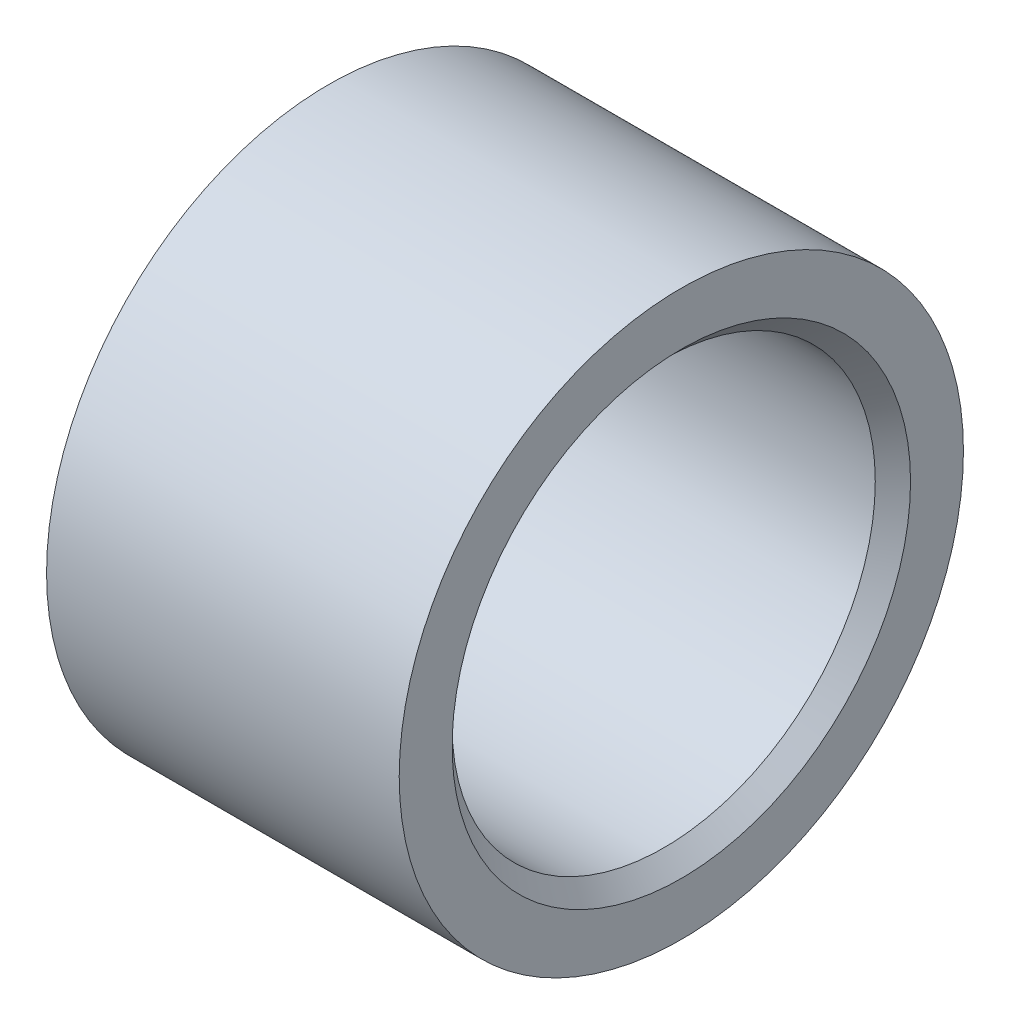
ISO-10303-21;
HEADER;
FILE_DESCRIPTION(('STEP AP214'),'2;1');
FILE_NAME('part.step','',(''),(''),'','','');
FILE_SCHEMA(('AUTOMOTIVE_DESIGN { 1 0 10303 214 1 1 1 1 }'));
ENDSEC;
DATA;
#1=APPLICATION_CONTEXT('core data for automotive mechanical design processes');
#2=APPLICATION_PROTOCOL_DEFINITION('international standard','automotive_design',2000,#1);
#3=PRODUCT_CONTEXT('',#1,'mechanical');
#4=PRODUCT('Part','Part','',(#3));
#5=PRODUCT_RELATED_PRODUCT_CATEGORY('part','',(#4));
#6=PRODUCT_DEFINITION_FORMATION('','',#4);
#7=PRODUCT_DEFINITION_CONTEXT('part definition',#1,'design');
#8=PRODUCT_DEFINITION('design','',#6,#7);
#9=PRODUCT_DEFINITION_SHAPE('','',#8);
#10=(LENGTH_UNIT() NAMED_UNIT(*) SI_UNIT(.MILLI.,.METRE.));
#11=(NAMED_UNIT(*) PLANE_ANGLE_UNIT() SI_UNIT($,.RADIAN.));
#12=(NAMED_UNIT(*) SI_UNIT($,.STERADIAN.) SOLID_ANGLE_UNIT());
#13=UNCERTAINTY_MEASURE_WITH_UNIT(LENGTH_MEASURE(1.E-05),#10,'distance_accuracy_value','');
#14=(GEOMETRIC_REPRESENTATION_CONTEXT(3) GLOBAL_UNCERTAINTY_ASSIGNED_CONTEXT((#13)) GLOBAL_UNIT_ASSIGNED_CONTEXT((#10,
#11,#12)) REPRESENTATION_CONTEXT('',''));
#15=CARTESIAN_POINT('',(0.,0.,0.));
#16=DIRECTION('',(0.,0.,1.));
#17=DIRECTION('',(1.,0.,0.));
#18=AXIS2_PLACEMENT_3D('',#15,#16,#17);
#19=CARTESIAN_POINT('',(10.,0.,0.));
#20=DIRECTION('',(1.,0.,0.));
#21=DIRECTION('',(0.,0.,-1.));
#22=AXIS2_PLACEMENT_3D('',#19,#20,#21);
#23=PLANE('',#22);
#24=CARTESIAN_POINT('',(10.,0.,0.));
#25=DIRECTION('',(1.,0.,0.));
#26=DIRECTION('',(0.,0.,-1.));
#27=AXIS2_PLACEMENT_3D('',#24,#25,#26);
#28=CIRCLE('',#27,6.50000000000001);
#29=CARTESIAN_POINT('',(10.,0.,-6.50000000000001));
#30=VERTEX_POINT('',#29);
#31=EDGE_CURVE('E10',#30,#30,#28,.F.);
#32=ORIENTED_EDGE('',*,*,#31,.T.);
#33=EDGE_LOOP('',(#32));
#34=FACE_BOUND('',#33,.T.);
#35=CARTESIAN_POINT('',(10.,0.,0.));
#36=DIRECTION('',(1.,0.,0.));
#37=DIRECTION('',(0.,0.,-1.));
#38=AXIS2_PLACEMENT_3D('',#35,#36,#37);
#39=CIRCLE('',#38,8.);
#40=CARTESIAN_POINT('',(10.,0.,-8.));
#41=VERTEX_POINT('',#40);
#42=EDGE_CURVE('E51',#41,#41,#39,.T.);
#43=ORIENTED_EDGE('',*,*,#42,.T.);
#44=EDGE_LOOP('',(#43));
#45=FACE_BOUND('',#44,.T.);
#46=ADVANCED_FACE('F31',(#34,#45),#23,.T.);
#47=CARTESIAN_POINT('',(0.,0.,0.));
#48=DIRECTION('',(1.,0.,0.));
#49=DIRECTION('',(0.,0.,-1.));
#50=AXIS2_PLACEMENT_3D('',#47,#48,#49);
#51=PLANE('',#50);
#52=CARTESIAN_POINT('',(0.,0.,0.));
#53=DIRECTION('',(1.,0.,0.));
#54=DIRECTION('',(0.,0.,-1.));
#55=AXIS2_PLACEMENT_3D('',#52,#53,#54);
#56=CIRCLE('',#55,6.5);
#57=CARTESIAN_POINT('',(0.,0.,-6.5));
#58=VERTEX_POINT('',#57);
#59=EDGE_CURVE('E46',#58,#58,#56,.T.);
#60=ORIENTED_EDGE('',*,*,#59,.T.);
#61=EDGE_LOOP('',(#60));
#62=FACE_BOUND('',#61,.T.);
#63=CARTESIAN_POINT('',(0.,0.,0.));
#64=DIRECTION('',(1.,0.,0.));
#65=DIRECTION('',(0.,0.,-1.));
#66=AXIS2_PLACEMENT_3D('',#63,#64,#65);
#67=CIRCLE('',#66,8.);
#68=CARTESIAN_POINT('',(0.,0.,-8.));
#69=VERTEX_POINT('',#68);
#70=EDGE_CURVE('E52',#69,#69,#67,.T.);
#71=ORIENTED_EDGE('',*,*,#70,.F.);
#72=EDGE_LOOP('',(#71));
#73=FACE_BOUND('',#72,.T.);
#74=ADVANCED_FACE('F63',(#62,#73),#51,.F.);
#75=CARTESIAN_POINT('',(10.,0.,0.));
#76=DIRECTION('',(-1.,0.,0.));
#77=DIRECTION('',(0.,0.,1.));
#78=AXIS2_PLACEMENT_3D('',#75,#76,#77);
#79=CYLINDRICAL_SURFACE('',#78,8.);
#80=ORIENTED_EDGE('',*,*,#42,.F.);
#81=EDGE_LOOP('',(#80));
#82=FACE_BOUND('',#81,.T.);
#83=ORIENTED_EDGE('',*,*,#70,.T.);
#84=EDGE_LOOP('',(#83));
#85=FACE_BOUND('',#84,.T.);
#86=ADVANCED_FACE('F59',(#82,#85),#79,.T.);
#87=CARTESIAN_POINT('',(10.,0.,0.));
#88=DIRECTION('',(-1.,0.,0.));
#89=DIRECTION('',(0.,0.,1.));
#90=AXIS2_PLACEMENT_3D('',#87,#88,#89);
#91=CYLINDRICAL_SURFACE('',#90,6.);
#92=CARTESIAN_POINT('',(0.500000000000006,0.,0.));
#93=DIRECTION('',(1.,0.,0.));
#94=DIRECTION('',(0.,0.,-1.));
#95=AXIS2_PLACEMENT_3D('',#92,#93,#94);
#96=CIRCLE('',#95,6.);
#97=CARTESIAN_POINT('',(0.500000000000006,0.,-6.));
#98=VERTEX_POINT('',#97);
#99=EDGE_CURVE('E38',#98,#98,#96,.F.);
#100=ORIENTED_EDGE('',*,*,#99,.T.);
#101=EDGE_LOOP('',(#100));
#102=FACE_BOUND('',#101,.T.);
#103=CARTESIAN_POINT('',(9.49999999999999,0.,0.));
#104=DIRECTION('',(1.,0.,0.));
#105=DIRECTION('',(0.,0.,-1.));
#106=AXIS2_PLACEMENT_3D('',#103,#104,#105);
#107=CIRCLE('',#106,6.);
#108=CARTESIAN_POINT('',(9.49999999999999,0.,-6.));
#109=VERTEX_POINT('',#108);
#110=EDGE_CURVE('E42',#109,#109,#107,.T.);
#111=ORIENTED_EDGE('',*,*,#110,.T.);
#112=EDGE_LOOP('',(#111));
#113=FACE_BOUND('',#112,.T.);
#114=ADVANCED_FACE('F62',(#102,#113),#91,.F.);
#115=CARTESIAN_POINT('',(0.,0.,0.));
#116=DIRECTION('',(-1.,0.,0.));
#117=DIRECTION('',(0.,0.,1.));
#118=AXIS2_PLACEMENT_3D('',#115,#116,#117);
#119=CONICAL_SURFACE('',#118,6.5,0.785398163397446);
#120=ORIENTED_EDGE('',*,*,#99,.F.);
#121=EDGE_LOOP('',(#120));
#122=FACE_BOUND('',#121,.T.);
#123=ORIENTED_EDGE('',*,*,#59,.F.);
#124=EDGE_LOOP('',(#123));
#125=FACE_BOUND('',#124,.T.);
#126=ADVANCED_FACE('F75',(#122,#125),#119,.F.);
#127=CARTESIAN_POINT('',(9.49999999999999,0.,0.));
#128=DIRECTION('',(1.,0.,0.));
#129=DIRECTION('',(0.,0.,-1.));
#130=AXIS2_PLACEMENT_3D('',#127,#128,#129);
#131=CONICAL_SURFACE('',#130,6.,0.785398163397452);
#132=ORIENTED_EDGE('',*,*,#31,.F.);
#133=EDGE_LOOP('',(#132));
#134=FACE_BOUND('',#133,.T.);
#135=ORIENTED_EDGE('',*,*,#110,.F.);
#136=EDGE_LOOP('',(#135));
#137=FACE_BOUND('',#136,.T.);
#138=ADVANCED_FACE('F33',(#134,#137),#131,.F.);
#139=CLOSED_SHELL('',(#46,#74,#86,#114,#126,#138));
#140=MANIFOLD_SOLID_BREP('B2',#139);
#141=ADVANCED_BREP_SHAPE_REPRESENTATION('',(#18,#140),#14);
#142=SHAPE_DEFINITION_REPRESENTATION(#9,#141);
ENDSEC;
END-ISO-10303-21;
